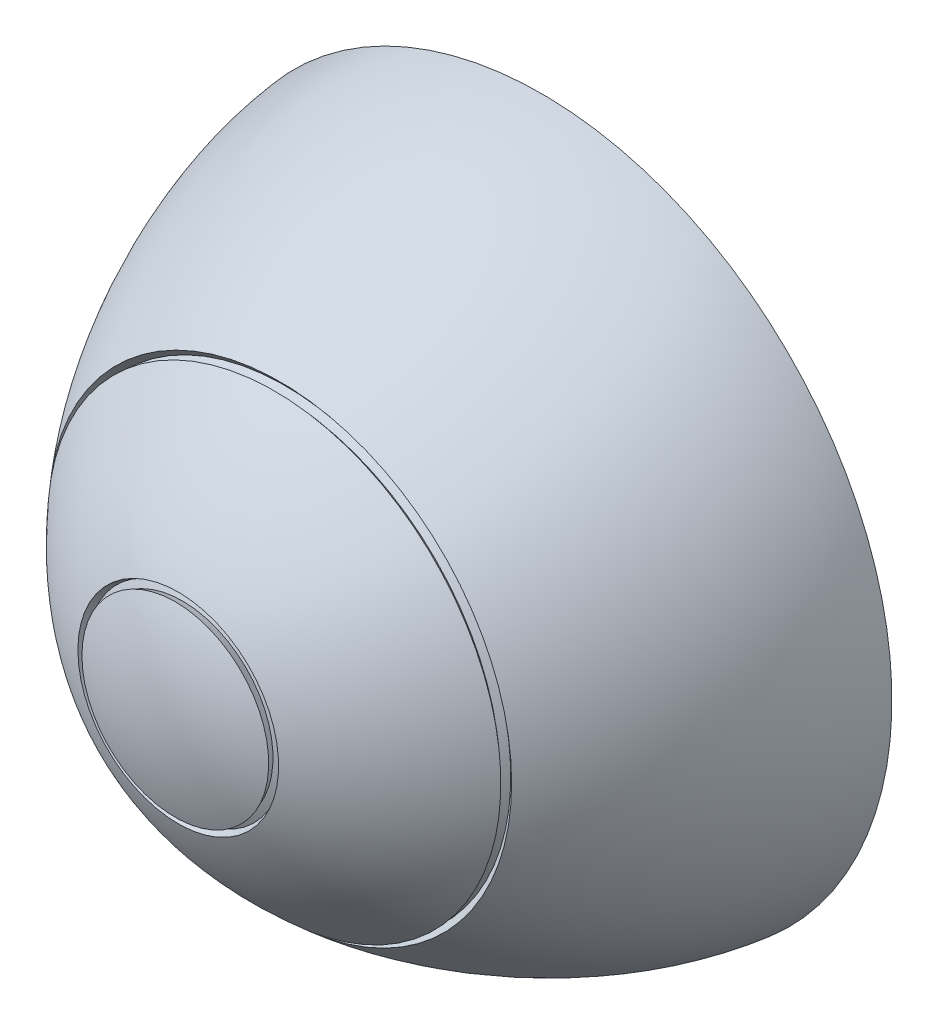
ISO-10303-21;
HEADER;
FILE_DESCRIPTION(('STEP AP214'),'2;1');
FILE_NAME('part.step','',(''),(''),'','','');
FILE_SCHEMA(('AUTOMOTIVE_DESIGN { 1 0 10303 214 1 1 1 1 }'));
ENDSEC;
DATA;
#1=APPLICATION_CONTEXT('core data for automotive mechanical design processes');
#2=APPLICATION_PROTOCOL_DEFINITION('international standard','automotive_design',2000,#1);
#3=PRODUCT_CONTEXT('',#1,'mechanical');
#4=PRODUCT('Part','Part','',(#3));
#5=PRODUCT_RELATED_PRODUCT_CATEGORY('part','',(#4));
#6=PRODUCT_DEFINITION_FORMATION('','',#4);
#7=PRODUCT_DEFINITION_CONTEXT('part definition',#1,'design');
#8=PRODUCT_DEFINITION('design','',#6,#7);
#9=PRODUCT_DEFINITION_SHAPE('','',#8);
#10=(LENGTH_UNIT() NAMED_UNIT(*) SI_UNIT(.MILLI.,.METRE.));
#11=(NAMED_UNIT(*) PLANE_ANGLE_UNIT() SI_UNIT($,.RADIAN.));
#12=(NAMED_UNIT(*) SI_UNIT($,.STERADIAN.) SOLID_ANGLE_UNIT());
#13=UNCERTAINTY_MEASURE_WITH_UNIT(LENGTH_MEASURE(1.E-05),#10,'distance_accuracy_value','');
#14=(GEOMETRIC_REPRESENTATION_CONTEXT(3) GLOBAL_UNCERTAINTY_ASSIGNED_CONTEXT((#13)) GLOBAL_UNIT_ASSIGNED_CONTEXT((#10,
#11,#12)) REPRESENTATION_CONTEXT('',''));
#15=CARTESIAN_POINT('',(0.,0.,0.));
#16=DIRECTION('',(0.,0.,1.));
#17=DIRECTION('',(1.,0.,0.));
#18=AXIS2_PLACEMENT_3D('',#15,#16,#17);
#19=CARTESIAN_POINT('',(0.,9.,0.));
#20=CARTESIAN_POINT('',(0.,8.59867243843241,4.0304307422595));
#21=CARTESIAN_POINT('',(0.,4.86584456092145,9.90998323272872));
#22=CARTESIAN_POINT('',(0.,0.,9.9));
#23=B_SPLINE_CURVE_WITH_KNOTS('',3,(#19,#20,#21,#22),.UNSPECIFIED.,.F.,.F.,(4,4),(0.,1.),.UNSPECIFIED.);
#24=CARTESIAN_POINT('',(0.,0.,-0.495249580818226));
#25=DIRECTION('',(0.,0.,-1.));
#26=AXIS1_PLACEMENT('',#24,#25);
#27=SURFACE_OF_REVOLUTION('',#23,#26);
#28=CARTESIAN_POINT('',(0.,0.,9.34552875258093));
#29=DIRECTION('',(0.,0.,-1.));
#30=DIRECTION('',(-1.,0.,0.));
#31=AXIS2_PLACEMENT_3D('',#28,#29,#30);
#32=CIRCLE('',#31,2.58014707616978);
#33=CARTESIAN_POINT('',(-2.58014707616978,0.,9.34552875258093));
#34=VERTEX_POINT('',#33);
#35=EDGE_CURVE('E40',#34,#34,#32,.F.);
#36=ORIENTED_EDGE('',*,*,#35,.F.);
#37=EDGE_LOOP('',(#36));
#38=FACE_BOUND('',#37,.T.);
#39=CARTESIAN_POINT('',(0.,0.,6.87848447823506));
#40=DIRECTION('',(0.,0.,-1.));
#41=DIRECTION('',(-1.,0.,0.));
#42=AXIS2_PLACEMENT_3D('',#39,#40,#41);
#43=CIRCLE('',#42,5.82579941114546);
#44=CARTESIAN_POINT('',(-5.82579941114546,0.,6.87848447823506));
#45=VERTEX_POINT('',#44);
#46=EDGE_CURVE('E77',#45,#45,#43,.T.);
#47=ORIENTED_EDGE('',*,*,#46,.F.);
#48=EDGE_LOOP('',(#47));
#49=FACE_BOUND('',#48,.T.);
#50=ADVANCED_FACE('F35',(#38,#49),#27,.F.);
#51=CARTESIAN_POINT('',(0.,0.,6.7297607692922));
#52=DIRECTION('',(0.,0.,-1.));
#53=DIRECTION('',(-1.,0.,0.));
#54=AXIS2_PLACEMENT_3D('',#51,#52,#53);
#55=CIRCLE('',#54,5.95469852674523);
#56=CARTESIAN_POINT('',(-5.95469852674523,0.,6.7297607692922));
#57=VERTEX_POINT('',#56);
#58=EDGE_CURVE('E72',#57,#57,#55,.F.);
#59=ORIENTED_EDGE('',*,*,#58,.F.);
#60=EDGE_LOOP('',(#59));
#61=FACE_BOUND('',#60,.T.);
#62=CARTESIAN_POINT('',(0.,0.,0.));
#63=DIRECTION('',(0.,0.,-1.));
#64=DIRECTION('',(-1.,0.,0.));
#65=AXIS2_PLACEMENT_3D('',#62,#63,#64);
#66=CIRCLE('',#65,9.);
#67=CARTESIAN_POINT('',(-9.,0.,0.));
#68=VERTEX_POINT('',#67);
#69=EDGE_CURVE('E11',#68,#68,#66,.T.);
#70=ORIENTED_EDGE('',*,*,#69,.F.);
#71=EDGE_LOOP('',(#70));
#72=FACE_BOUND('',#71,.T.);
#73=ADVANCED_FACE('F51',(#61,#72),#27,.F.);
#74=CARTESIAN_POINT('',(0.,0.,0.));
#75=DIRECTION('',(0.,0.,-1.));
#76=DIRECTION('',(-1.,0.,0.));
#77=AXIS2_PLACEMENT_3D('',#74,#75,#76);
#78=PLANE('',#77);
#79=CARTESIAN_POINT('',(0.,0.,-2.71018017056202E-12));
#80=DIRECTION('',(0.,0.,-1.));
#81=DIRECTION('',(-1.,0.,0.));
#82=AXIS2_PLACEMENT_3D('',#79,#80,#81);
#83=CIRCLE('',#82,6.98681090878321);
#84=CARTESIAN_POINT('',(-6.98681090878321,0.,-2.71018017056202E-12));
#85=VERTEX_POINT('',#84);
#86=EDGE_CURVE('E44',#85,#85,#83,.T.);
#87=ORIENTED_EDGE('',*,*,#86,.F.);
#88=EDGE_LOOP('',(#87));
#89=FACE_BOUND('',#88,.T.);
#90=ORIENTED_EDGE('',*,*,#69,.T.);
#91=EDGE_LOOP('',(#90));
#92=FACE_BOUND('',#91,.T.);
#93=ADVANCED_FACE('F62',(#89,#92),#78,.T.);
#94=CARTESIAN_POINT('',(0.,456.342047395972,-3974.24789696165));
#95=CARTESIAN_POINT('',(0.,4.45816256945547,15.5269315562771));
#96=CARTESIAN_POINT('',(0.,7.18829785953538,-1.75697932994046));
#97=CARTESIAN_POINT('',(0.,6.99769909930443,-0.0863116052299104));
#98=CARTESIAN_POINT('',(0.,6.99423287660671,-0.0575711854007708));
#99=CARTESIAN_POINT('',(0.,6.98336353452306,0.0275226575940394));
#100=CARTESIAN_POINT('',(0.,6.97525452339231,0.0849318268912477));
#101=CARTESIAN_POINT('',(0.,6.94855991539065,0.257903575081638));
#102=CARTESIAN_POINT('',(0.,6.92754494919508,0.374697633830307));
#103=CARTESIAN_POINT('',(0.,6.85558027005335,0.727785948122909));
#104=CARTESIAN_POINT('',(0.,6.79574009109293,0.966699441098619));
#105=CARTESIAN_POINT('',(0.,6.58569670632123,1.68499848922897));
#106=CARTESIAN_POINT('',(0.,6.40530301251352,2.16561255005365));
#107=CARTESIAN_POINT('',(0.,5.76941414483615,3.57450938934416));
#108=CARTESIAN_POINT('',(0.,5.21982756911155,4.47216539362787));
#109=CARTESIAN_POINT('',(0.,3.93634356781132,6.04391501080345));
#110=CARTESIAN_POINT('',(0.,3.19724412710002,6.71875761671539));
#111=CARTESIAN_POINT('',(0.,2.0218895628009,7.4186702197679));
#112=CARTESIAN_POINT('',(0.,1.62043266178242,7.59919798273473));
#113=CARTESIAN_POINT('',(0.,1.01752568717964,7.77955443948931));
#114=CARTESIAN_POINT('',(0.,0.816381568014456,7.82474999289042));
#115=CARTESIAN_POINT('',(0.,0.514880376663292,7.86991228588672));
#116=CARTESIAN_POINT('',(0.,0.414399203040013,7.88120137951934));
#117=CARTESIAN_POINT('',(0.,0.263672138892532,7.89248866574454));
#118=CARTESIAN_POINT('',(0.,0.213372418516875,7.89531153759698));
#119=CARTESIAN_POINT('',(0.,0.138012072244872,7.89813377904067));
#120=CARTESIAN_POINT('',(0.,0.112771568778894,7.89883479979997));
#121=CARTESIAN_POINT('',(0.,-1.25128919499095,7.92472129332802));
#122=CARTESIAN_POINT('',(0.,19.5061126698314,6.91876722724785));
#123=CARTESIAN_POINT('',(0.,-3999.07327185497,58.782260214774));
#124=B_SPLINE_CURVE_WITH_KNOTS('',3,(#94,#95,#96,#97,#98,#99,#100,#101,#102,#103,#104,#105,#106,
#107,#108,#109,#110,#111,#112,#113,#114,#115,#116,#117,#118,#119,#120,#121,#122,#123),
.UNSPECIFIED.,.F.,.F.,(4,2,2,2,2,2,2,2,2,2,2,2,2,2,4),(-0.447231992507462,0.00781249999999999,
0.015625,0.03125,0.0625,0.125,0.25,0.5,0.75,0.875,0.9375,0.96875,0.984375,0.9921875,
1.4019254822742),.UNSPECIFIED.);
#125=CARTESIAN_POINT('',(0.,0.,-0.495249580818226));
#126=DIRECTION('',(0.,0.,-1.));
#127=AXIS1_PLACEMENT('',#125,#126);
#128=SURFACE_OF_REVOLUTION('',#124,#127);
#129=ORIENTED_EDGE('',*,*,#86,.T.);
#130=EDGE_LOOP('',(#129));
#131=FACE_BOUND('',#130,.T.);
#132=CARTESIAN_POINT('',(0.,0.,4.00000000000001));
#133=DIRECTION('',(0.,0.,-1.));
#134=DIRECTION('',(-1.,0.,0.));
#135=AXIS2_PLACEMENT_3D('',#132,#133,#134);
#136=CIRCLE('',#135,5.46995306080622);
#137=CARTESIAN_POINT('',(-5.46995306080622,0.,4.00000000000001));
#138=VERTEX_POINT('',#137);
#139=EDGE_CURVE('E76',#138,#138,#136,.T.);
#140=ORIENTED_EDGE('',*,*,#139,.F.);
#141=EDGE_LOOP('',(#140));
#142=FACE_BOUND('',#141,.T.);
#143=ADVANCED_FACE('F67',(#131,#142),#128,.T.);
#144=CARTESIAN_POINT('',(0.,5.46995306080622,4.00000000000001));
#145=DIRECTION('',(0.,0.,1.));
#146=DIRECTION('',(1.,0.,0.));
#147=AXIS2_PLACEMENT_3D('',#144,#145,#146);
#148=PLANE('',#147);
#149=ORIENTED_EDGE('',*,*,#139,.T.);
#150=EDGE_LOOP('',(#149));
#151=FACE_BOUND('',#150,.T.);
#152=ADVANCED_FACE('F118',(#151),#148,.F.);
#153=CARTESIAN_POINT('',(0.,0.,6.59999999999549));
#154=DIRECTION('',(0.,0.,1.));
#155=DIRECTION('',(1.,0.,0.));
#156=AXIS2_PLACEMENT_3D('',#153,#154,#155);
#157=CONICAL_SURFACE('',#156,5.80252548812245,0.864726133435436);
#158=ORIENTED_EDGE('',*,*,#58,.T.);
#159=EDGE_LOOP('',(#158));
#160=FACE_BOUND('',#159,.T.);
#161=CARTESIAN_POINT('',(0.,0.,6.59999999999549));
#162=DIRECTION('',(0.,0.,-1.));
#163=DIRECTION('',(-1.,0.,0.));
#164=AXIS2_PLACEMENT_3D('',#161,#162,#163);
#165=CIRCLE('',#164,5.80252548812245);
#166=CARTESIAN_POINT('',(-5.80252548812245,0.,6.59999999999549));
#167=VERTEX_POINT('',#166);
#168=EDGE_CURVE('E82',#167,#167,#165,.T.);
#169=ORIENTED_EDGE('',*,*,#168,.T.);
#170=EDGE_LOOP('',(#169));
#171=FACE_BOUND('',#170,.T.);
#172=ADVANCED_FACE('F113',(#160,#171),#157,.F.);
#173=CARTESIAN_POINT('',(0.,0.011801728242804,9.70001352224084));
#174=CARTESIAN_POINT('',(0.,0.0870203395344737,9.69979737518443));
#175=CARTESIAN_POINT('',(0.,0.157821482363418,9.69865372439001));
#176=CARTESIAN_POINT('',(0.,0.303168281612692,9.69321049355522));
#177=CARTESIAN_POINT('',(0.,0.375800233547961,9.68913189778455));
#178=CARTESIAN_POINT('',(0.,0.593396127781379,9.67283709927884));
#179=CARTESIAN_POINT('',(0.,0.738080720355234,9.65656049145616));
#180=CARTESIAN_POINT('',(0.,1.16992994088004,9.59187318146524));
#181=CARTESIAN_POINT('',(0.,1.4548429094412,9.52754668095699));
#182=CARTESIAN_POINT('',(0.,2.29341704407914,9.2766916303101));
#183=CARTESIAN_POINT('',(0.,2.83013640528562,9.03234494670907));
#184=CARTESIAN_POINT('',(0.,3.83913100599595,8.43149813937122));
#185=CARTESIAN_POINT('',(0.,4.31187945474238,8.07549752747784));
#186=CARTESIAN_POINT('',(0.,5.19098858792989,7.28743628053431));
#187=CARTESIAN_POINT('',(0.,5.59765918008798,6.85531683836234));
#188=CARTESIAN_POINT('',(0.,6.72155722189184,5.47899557907117));
#189=CARTESIAN_POINT('',(0.,7.34600047418778,4.4569019497211));
#190=CARTESIAN_POINT('',(0.,8.07796405061644,2.83513874277447));
#191=CARTESIAN_POINT('',(0.,8.28737333559116,2.27901977097926));
#192=CARTESIAN_POINT('',(0.,8.53637796602986,1.42748241254937));
#193=CARTESIAN_POINT('',(0.,8.60841994626038,1.14074094100754));
#194=CARTESIAN_POINT('',(0.,8.69673421029639,0.707434838786852));
#195=CARTESIAN_POINT('',(0.,8.72286570711682,0.562472110451749));
#196=CARTESIAN_POINT('',(0.,8.75651115851717,0.34446132164337));
#197=CARTESIAN_POINT('',(0.,8.76680069226593,0.27168484122802));
#198=CARTESIAN_POINT('',(0.,8.78540482939668,0.126036879109031));
#199=CARTESIAN_POINT('',(0.,8.79340517640416,0.0545566679570925));
#200=CARTESIAN_POINT('',(0.,8.80103029554507,-0.0202745335117226));
#201=B_SPLINE_CURVE_WITH_KNOTS('',3,(#173,#174,#175,#176,#177,#178,#179,#180,#181,#182,#183,
#184,#185,#186,#187,#188,#189,#190,#191,#192,#193,#194,#195,#196,#197,#198,#199,#200),
.UNSPECIFIED.,.F.,.F.,(4,2,2,2,2,2,2,2,2,2,2,2,2,4),(0.,0.015625,0.0312499999999999,
0.0624999999999999,0.125,0.25,0.375,0.5,0.75,0.875,0.9375,0.96875,0.984375,1.),.UNSPECIFIED.);
#202=CARTESIAN_POINT('',(0.,0.,-0.495249580818226));
#203=DIRECTION('',(0.,0.,-1.));
#204=AXIS1_PLACEMENT('',#202,#203);
#205=SURFACE_OF_REVOLUTION('',#201,#204);
#206=ORIENTED_EDGE('',*,*,#168,.F.);
#207=EDGE_LOOP('',(#206));
#208=FACE_BOUND('',#207,.T.);
#209=CARTESIAN_POINT('',(0.,0.,6.74632453296007));
#210=DIRECTION('',(0.,0.,-1.));
#211=DIRECTION('',(-1.,0.,0.));
#212=AXIS2_PLACEMENT_3D('',#209,#210,#211);
#213=CIRCLE('',#212,5.67572935267157);
#214=CARTESIAN_POINT('',(-5.67572935267157,0.,6.74632453296007));
#215=VERTEX_POINT('',#214);
#216=EDGE_CURVE('E89',#215,#215,#213,.T.);
#217=ORIENTED_EDGE('',*,*,#216,.T.);
#218=EDGE_LOOP('',(#217));
#219=FACE_BOUND('',#218,.T.);
#220=ADVANCED_FACE('F108',(#208,#219),#205,.T.);
#221=CARTESIAN_POINT('',(0.,0.,7.01069146156522));
#222=DIRECTION('',(0.,0.,1.));
#223=DIRECTION('',(1.,0.,0.));
#224=AXIS2_PLACEMENT_3D('',#221,#222,#223);
#225=CONICAL_SURFACE('',#224,5.97592288219966,0.848772464725836);
#226=ORIENTED_EDGE('',*,*,#46,.T.);
#227=EDGE_LOOP('',(#226));
#228=FACE_BOUND('',#227,.T.);
#229=ORIENTED_EDGE('',*,*,#216,.F.);
#230=EDGE_LOOP('',(#229));
#231=FACE_BOUND('',#230,.T.);
#232=ADVANCED_FACE('F112',(#228,#231),#225,.T.);
#233=CARTESIAN_POINT('',(0.,0.,9.16234985340581));
#234=DIRECTION('',(0.,0.,1.));
#235=DIRECTION('',(1.,0.,0.));
#236=AXIS2_PLACEMENT_3D('',#233,#234,#235);
#237=CONICAL_SURFACE('',#236,2.5,0.412439344121557);
#238=ORIENTED_EDGE('',*,*,#35,.T.);
#239=EDGE_LOOP('',(#238));
#240=FACE_BOUND('',#239,.T.);
#241=CARTESIAN_POINT('',(0.,0.,9.16234985340581));
#242=DIRECTION('',(0.,0.,-1.));
#243=DIRECTION('',(-1.,0.,0.));
#244=AXIS2_PLACEMENT_3D('',#241,#242,#243);
#245=CIRCLE('',#244,2.5);
#246=CARTESIAN_POINT('',(-2.5,0.,9.16234985340581));
#247=VERTEX_POINT('',#246);
#248=EDGE_CURVE('E87',#247,#247,#245,.T.);
#249=ORIENTED_EDGE('',*,*,#248,.T.);
#250=EDGE_LOOP('',(#249));
#251=FACE_BOUND('',#250,.T.);
#252=ADVANCED_FACE('F149',(#240,#251),#237,.F.);
#253=CARTESIAN_POINT('',(0.,0.0123764428180197,9.70001269649701));
#254=CARTESIAN_POINT('',(0.,1.10232915275981,9.7000126964989));
#255=CARTESIAN_POINT('',(0.,2.13464798211528,9.39506949827326));
#256=CARTESIAN_POINT('',(0.,4.0413947488585,8.35066761176046));
#257=CARTESIAN_POINT('',(0.,4.91440729918963,7.61061246866173));
#258=CARTESIAN_POINT('',(0.,5.67571754697693,6.74628979586207));
#259=B_SPLINE_CURVE_WITH_KNOTS('',3,(#253,#254,#255,#256,#257,#258),.UNSPECIFIED.,.F.,.F.,(4,2,
4),(0.,0.5,1.),.UNSPECIFIED.);
#260=CARTESIAN_POINT('',(0.,0.,-0.495249580818226));
#261=DIRECTION('',(0.,0.,-1.));
#262=AXIS1_PLACEMENT('',#260,#261);
#263=SURFACE_OF_REVOLUTION('',#259,#262);
#264=ORIENTED_EDGE('',*,*,#248,.F.);
#265=EDGE_LOOP('',(#264));
#266=FACE_BOUND('',#265,.T.);
#267=CARTESIAN_POINT('',(0.,0.,9.23582468754473));
#268=DIRECTION('',(0.,0.,-1.));
#269=DIRECTION('',(-1.,0.,0.));
#270=AXIS2_PLACEMENT_3D('',#267,#268,#269);
#271=CIRCLE('',#270,2.32569834430003);
#272=CARTESIAN_POINT('',(-2.32569834430003,0.,9.23582468754473));
#273=VERTEX_POINT('',#272);
#274=EDGE_CURVE('E91',#273,#273,#271,.T.);
#275=ORIENTED_EDGE('',*,*,#274,.T.);
#276=EDGE_LOOP('',(#275));
#277=FACE_BOUND('',#276,.T.);
#278=ADVANCED_FACE('F55',(#266,#277),#263,.T.);
#279=CARTESIAN_POINT('',(0.,0.,9.6063517350399));
#280=DIRECTION('',(0.,0.,1.));
#281=DIRECTION('',(1.,0.,0.));
#282=AXIS2_PLACEMENT_3D('',#279,#280,#281);
#283=CONICAL_SURFACE('',#282,2.47598084262911,0.385317038278223);
#284=CARTESIAN_POINT('',(0.,0.,9.42108818930401));
#285=DIRECTION('',(0.,0.,-1.));
#286=DIRECTION('',(-1.,0.,0.));
#287=AXIS2_PLACEMENT_3D('',#284,#285,#286);
#288=CIRCLE('',#287,2.4008395845463);
#289=CARTESIAN_POINT('',(-2.4008395845463,0.,9.42108818930401));
#290=VERTEX_POINT('',#289);
#291=EDGE_CURVE('E85',#290,#290,#288,.T.);
#292=ORIENTED_EDGE('',*,*,#291,.T.);
#293=EDGE_LOOP('',(#292));
#294=FACE_BOUND('',#293,.T.);
#295=ORIENTED_EDGE('',*,*,#274,.F.);
#296=EDGE_LOOP('',(#295));
#297=FACE_BOUND('',#296,.T.);
#298=ADVANCED_FACE('F49',(#294,#297),#283,.T.);
#299=ORIENTED_EDGE('',*,*,#291,.F.);
#300=EDGE_LOOP('',(#299));
#301=FACE_BOUND('',#300,.T.);
#302=CARTESIAN_POINT('',(0.,0.,9.9));
#303=VERTEX_POINT('',#302);
#304=VERTEX_LOOP('',#303);
#305=FACE_BOUND('',#304,.T.);
#306=ADVANCED_FACE('F37',(#301,#305),#27,.F.);
#307=CLOSED_SHELL('',(#50,#73,#93,#143,#152,#172,#220,#232,#252,#278,#298,#306));
#308=MANIFOLD_SOLID_BREP('B2',#307);
#309=ADVANCED_BREP_SHAPE_REPRESENTATION('',(#18,#308),#14);
#310=SHAPE_DEFINITION_REPRESENTATION(#9,#309);
ENDSEC;
END-ISO-10303-21;
